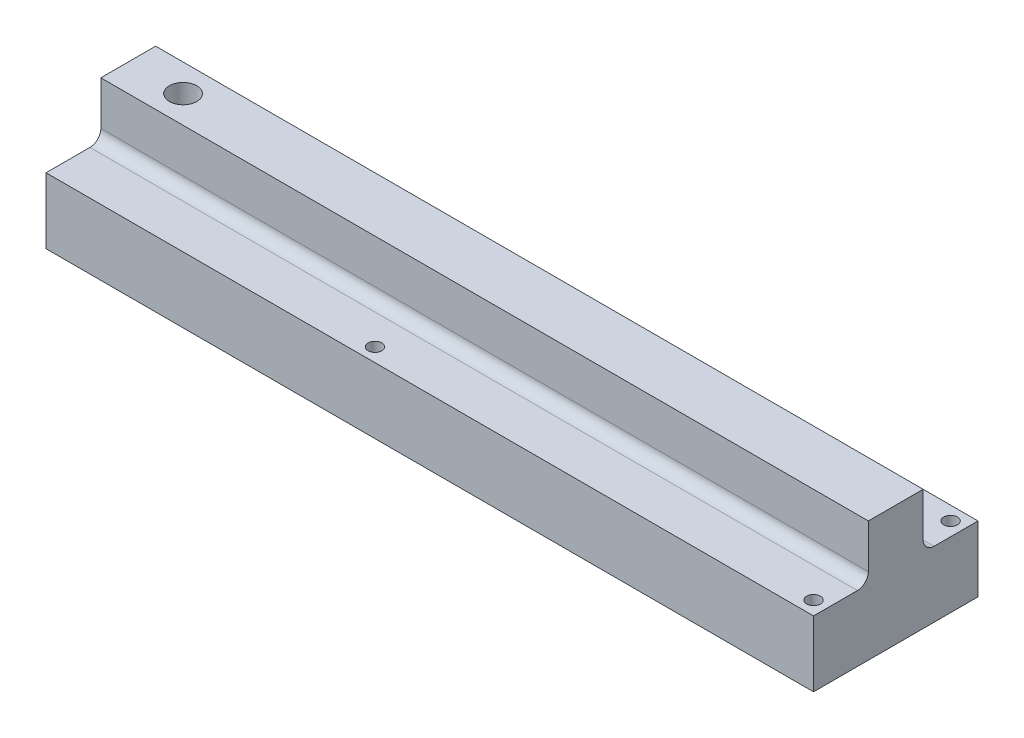
ISO-10303-21;
HEADER;
FILE_DESCRIPTION(('STEP AP214'),'2;1');
FILE_NAME('part.step','',(''),(''),'','','');
FILE_SCHEMA(('AUTOMOTIVE_DESIGN { 1 0 10303 214 1 1 1 1 }'));
ENDSEC;
DATA;
#1=APPLICATION_CONTEXT('core data for automotive mechanical design processes');
#2=APPLICATION_PROTOCOL_DEFINITION('international standard','automotive_design',2000,#1);
#3=PRODUCT_CONTEXT('',#1,'mechanical');
#4=PRODUCT('Part','Part','',(#3));
#5=PRODUCT_RELATED_PRODUCT_CATEGORY('part','',(#4));
#6=PRODUCT_DEFINITION_FORMATION('','',#4);
#7=PRODUCT_DEFINITION_CONTEXT('part definition',#1,'design');
#8=PRODUCT_DEFINITION('design','',#6,#7);
#9=PRODUCT_DEFINITION_SHAPE('','',#8);
#10=(LENGTH_UNIT() NAMED_UNIT(*) SI_UNIT(.MILLI.,.METRE.));
#11=(NAMED_UNIT(*) PLANE_ANGLE_UNIT() SI_UNIT($,.RADIAN.));
#12=(NAMED_UNIT(*) SI_UNIT($,.STERADIAN.) SOLID_ANGLE_UNIT());
#13=UNCERTAINTY_MEASURE_WITH_UNIT(LENGTH_MEASURE(1.E-05),#10,'distance_accuracy_value','');
#14=(GEOMETRIC_REPRESENTATION_CONTEXT(3) GLOBAL_UNCERTAINTY_ASSIGNED_CONTEXT((#13)) GLOBAL_UNIT_ASSIGNED_CONTEXT((#10,
#11,#12)) REPRESENTATION_CONTEXT('',''));
#15=CARTESIAN_POINT('',(0.,0.,0.));
#16=DIRECTION('',(0.,0.,1.));
#17=DIRECTION('',(1.,0.,0.));
#18=AXIS2_PLACEMENT_3D('',#15,#16,#17);
#19=CARTESIAN_POINT('',(280.,24.,0.));
#20=DIRECTION('',(0.,0.,1.));
#21=DIRECTION('',(1.,0.,0.));
#22=AXIS2_PLACEMENT_3D('',#19,#20,#21);
#23=PLANE('',#22);
#24=DIRECTION('',(0.,1.,0.));
#25=VECTOR('',#24,1.);
#26=CARTESIAN_POINT('',(0.,24.,0.));
#27=LINE('',#26,#25);
#28=CARTESIAN_POINT('',(0.,0.,0.));
#29=VERTEX_POINT('',#28);
#30=CARTESIAN_POINT('',(0.,24.,0.));
#31=VERTEX_POINT('',#30);
#32=EDGE_CURVE('E140',#29,#31,#27,.T.);
#33=ORIENTED_EDGE('',*,*,#32,.T.);
#34=DIRECTION('',(-1.,0.,0.));
#35=VECTOR('',#34,1.);
#36=CARTESIAN_POINT('',(280.,24.,0.));
#37=LINE('',#36,#35);
#38=CARTESIAN_POINT('',(280.,24.,0.));
#39=VERTEX_POINT('',#38);
#40=EDGE_CURVE('E121',#39,#31,#37,.T.);
#41=ORIENTED_EDGE('',*,*,#40,.F.);
#42=DIRECTION('',(0.,1.,0.));
#43=VECTOR('',#42,1.);
#44=CARTESIAN_POINT('',(280.,24.,0.));
#45=LINE('',#44,#43);
#46=CARTESIAN_POINT('',(280.,0.,0.));
#47=VERTEX_POINT('',#46);
#48=EDGE_CURVE('E128',#47,#39,#45,.T.);
#49=ORIENTED_EDGE('',*,*,#48,.F.);
#50=DIRECTION('',(-1.,0.,0.));
#51=VECTOR('',#50,1.);
#52=CARTESIAN_POINT('',(280.,0.,0.));
#53=LINE('',#52,#51);
#54=EDGE_CURVE('E189',#47,#29,#53,.T.);
#55=ORIENTED_EDGE('',*,*,#54,.T.);
#56=EDGE_LOOP('',(#33,#41,#49,#55));
#57=FACE_BOUND('',#56,.T.);
#58=ADVANCED_FACE('F39',(#57),#23,.F.);
#59=CARTESIAN_POINT('',(280.,24.,20.));
#60=DIRECTION('',(0.,-1.,0.));
#61=DIRECTION('',(0.,0.,-1.));
#62=AXIS2_PLACEMENT_3D('',#59,#60,#61);
#63=PLANE('',#62);
#64=CARTESIAN_POINT('',(115.,24.,5.));
#65=DIRECTION('',(0.,1.,0.));
#66=DIRECTION('',(0.,0.,-1.));
#67=AXIS2_PLACEMENT_3D('',#64,#65,#66);
#68=CIRCLE('',#67,2.50000000000001);
#69=CARTESIAN_POINT('',(115.,24.,2.49999999999999));
#70=VERTEX_POINT('',#69);
#71=EDGE_CURVE('E301',#70,#70,#68,.T.);
#72=ORIENTED_EDGE('',*,*,#71,.F.);
#73=EDGE_LOOP('',(#72));
#74=FACE_BOUND('',#73,.T.);
#75=CARTESIAN_POINT('',(275.,24.,5.));
#76=DIRECTION('',(0.,1.,0.));
#77=DIRECTION('',(0.,0.,-1.));
#78=AXIS2_PLACEMENT_3D('',#75,#76,#77);
#79=CIRCLE('',#78,2.50000000000002);
#80=CARTESIAN_POINT('',(275.,24.,2.49999999999997));
#81=VERTEX_POINT('',#80);
#82=EDGE_CURVE('E313',#81,#81,#79,.T.);
#83=ORIENTED_EDGE('',*,*,#82,.F.);
#84=EDGE_LOOP('',(#83));
#85=FACE_BOUND('',#84,.T.);
#86=DIRECTION('',(0.,0.,1.));
#87=VECTOR('',#86,1.);
#88=CARTESIAN_POINT('',(0.,24.,20.));
#89=LINE('',#88,#87);
#90=CARTESIAN_POINT('',(0.,24.,16.));
#91=VERTEX_POINT('',#90);
#92=EDGE_CURVE('E171',#31,#91,#89,.T.);
#93=ORIENTED_EDGE('',*,*,#92,.T.);
#94=DIRECTION('',(-1.,0.,0.));
#95=VECTOR('',#94,1.);
#96=CARTESIAN_POINT('',(280.,24.,16.));
#97=LINE('',#96,#95);
#98=CARTESIAN_POINT('',(280.,24.,16.));
#99=VERTEX_POINT('',#98);
#100=EDGE_CURVE('E124',#91,#99,#97,.F.);
#101=ORIENTED_EDGE('',*,*,#100,.T.);
#102=DIRECTION('',(0.,0.,1.));
#103=VECTOR('',#102,1.);
#104=CARTESIAN_POINT('',(280.,24.,20.));
#105=LINE('',#104,#103);
#106=EDGE_CURVE('E116',#39,#99,#105,.T.);
#107=ORIENTED_EDGE('',*,*,#106,.F.);
#108=ORIENTED_EDGE('',*,*,#40,.T.);
#109=EDGE_LOOP('',(#93,#101,#107,#108));
#110=FACE_BOUND('',#109,.T.);
#111=ADVANCED_FACE('F119',(#74,#85,#110),#63,.F.);
#112=CARTESIAN_POINT('',(280.,44.,20.));
#113=DIRECTION('',(0.,0.,1.));
#114=DIRECTION('',(0.,-1.,0.));
#115=AXIS2_PLACEMENT_3D('',#112,#113,#114);
#116=PLANE('',#115);
#117=DIRECTION('',(0.,1.,0.));
#118=VECTOR('',#117,1.);
#119=CARTESIAN_POINT('',(280.,44.,20.));
#120=LINE('',#119,#118);
#121=CARTESIAN_POINT('',(280.,28.,20.));
#122=VERTEX_POINT('',#121);
#123=CARTESIAN_POINT('',(280.,44.,20.));
#124=VERTEX_POINT('',#123);
#125=EDGE_CURVE('E127',#122,#124,#120,.T.);
#126=ORIENTED_EDGE('',*,*,#125,.F.);
#127=DIRECTION('',(-1.,0.,0.));
#128=VECTOR('',#127,1.);
#129=CARTESIAN_POINT('',(0.,28.,20.));
#130=LINE('',#129,#128);
#131=CARTESIAN_POINT('',(0.,28.,20.));
#132=VERTEX_POINT('',#131);
#133=EDGE_CURVE('E141',#122,#132,#130,.T.);
#134=ORIENTED_EDGE('',*,*,#133,.T.);
#135=DIRECTION('',(0.,1.,0.));
#136=VECTOR('',#135,1.);
#137=CARTESIAN_POINT('',(0.,44.,20.));
#138=LINE('',#137,#136);
#139=CARTESIAN_POINT('',(0.,44.,20.));
#140=VERTEX_POINT('',#139);
#141=EDGE_CURVE('E173',#132,#140,#138,.T.);
#142=ORIENTED_EDGE('',*,*,#141,.T.);
#143=DIRECTION('',(-1.,0.,0.));
#144=VECTOR('',#143,1.);
#145=CARTESIAN_POINT('',(280.,44.,20.));
#146=LINE('',#145,#144);
#147=EDGE_CURVE('E142',#124,#140,#146,.T.);
#148=ORIENTED_EDGE('',*,*,#147,.F.);
#149=EDGE_LOOP('',(#126,#134,#142,#148));
#150=FACE_BOUND('',#149,.T.);
#151=ADVANCED_FACE('F164',(#150),#116,.F.);
#152=CARTESIAN_POINT('',(280.,44.,40.));
#153=DIRECTION('',(0.,-1.,0.));
#154=DIRECTION('',(0.,0.,-1.));
#155=AXIS2_PLACEMENT_3D('',#152,#153,#154);
#156=PLANE('',#155);
#157=CARTESIAN_POINT('',(20.,44.,30.));
#158=DIRECTION('',(0.,1.,0.));
#159=DIRECTION('',(0.,0.,1.));
#160=AXIS2_PLACEMENT_3D('',#157,#158,#159);
#161=CIRCLE('',#160,5.);
#162=CARTESIAN_POINT('',(20.,44.,35.));
#163=VERTEX_POINT('',#162);
#164=EDGE_CURVE('E298',#163,#163,#161,.T.);
#165=ORIENTED_EDGE('',*,*,#164,.F.);
#166=EDGE_LOOP('',(#165));
#167=FACE_BOUND('',#166,.T.);
#168=DIRECTION('',(0.,0.,1.));
#169=VECTOR('',#168,1.);
#170=CARTESIAN_POINT('',(0.,44.,40.));
#171=LINE('',#170,#169);
#172=CARTESIAN_POINT('',(0.,44.,40.));
#173=VERTEX_POINT('',#172);
#174=EDGE_CURVE('E175',#140,#173,#171,.T.);
#175=ORIENTED_EDGE('',*,*,#174,.T.);
#176=DIRECTION('',(-1.,0.,0.));
#177=VECTOR('',#176,1.);
#178=CARTESIAN_POINT('',(280.,44.,40.));
#179=LINE('',#178,#177);
#180=CARTESIAN_POINT('',(280.,44.,40.));
#181=VERTEX_POINT('',#180);
#182=EDGE_CURVE('E147',#181,#173,#179,.T.);
#183=ORIENTED_EDGE('',*,*,#182,.F.);
#184=DIRECTION('',(0.,0.,1.));
#185=VECTOR('',#184,1.);
#186=CARTESIAN_POINT('',(280.,44.,40.));
#187=LINE('',#186,#185);
#188=EDGE_CURVE('E167',#124,#181,#187,.T.);
#189=ORIENTED_EDGE('',*,*,#188,.F.);
#190=ORIENTED_EDGE('',*,*,#147,.T.);
#191=EDGE_LOOP('',(#175,#183,#189,#190));
#192=FACE_BOUND('',#191,.T.);
#193=ADVANCED_FACE('F201',(#167,#192),#156,.F.);
#194=CARTESIAN_POINT('',(280.,24.,40.));
#195=DIRECTION('',(0.,0.,-1.));
#196=DIRECTION('',(-1.,0.,0.));
#197=AXIS2_PLACEMENT_3D('',#194,#195,#196);
#198=PLANE('',#197);
#199=DIRECTION('',(0.,-1.,0.));
#200=VECTOR('',#199,1.);
#201=CARTESIAN_POINT('',(0.,24.,40.));
#202=LINE('',#201,#200);
#203=CARTESIAN_POINT('',(0.,28.,40.));
#204=VERTEX_POINT('',#203);
#205=EDGE_CURVE('E182',#173,#204,#202,.T.);
#206=ORIENTED_EDGE('',*,*,#205,.T.);
#207=DIRECTION('',(-1.,0.,0.));
#208=VECTOR('',#207,1.);
#209=CARTESIAN_POINT('',(280.,28.,40.));
#210=LINE('',#209,#208);
#211=CARTESIAN_POINT('',(280.,28.,40.));
#212=VERTEX_POINT('',#211);
#213=EDGE_CURVE('E54',#204,#212,#210,.F.);
#214=ORIENTED_EDGE('',*,*,#213,.T.);
#215=DIRECTION('',(0.,-1.,0.));
#216=VECTOR('',#215,1.);
#217=CARTESIAN_POINT('',(280.,24.,40.));
#218=LINE('',#217,#216);
#219=EDGE_CURVE('E199',#181,#212,#218,.T.);
#220=ORIENTED_EDGE('',*,*,#219,.F.);
#221=ORIENTED_EDGE('',*,*,#182,.T.);
#222=EDGE_LOOP('',(#206,#214,#220,#221));
#223=FACE_BOUND('',#222,.T.);
#224=ADVANCED_FACE('F198',(#223),#198,.F.);
#225=CARTESIAN_POINT('',(280.,24.,60.));
#226=DIRECTION('',(0.,-1.,0.));
#227=DIRECTION('',(0.,0.,-1.));
#228=AXIS2_PLACEMENT_3D('',#225,#226,#227);
#229=PLANE('',#228);
#230=CARTESIAN_POINT('',(275.,24.,55.));
#231=DIRECTION('',(0.,1.,0.));
#232=DIRECTION('',(0.,0.,1.));
#233=AXIS2_PLACEMENT_3D('',#230,#231,#232);
#234=CIRCLE('',#233,2.50000000000002);
#235=CARTESIAN_POINT('',(275.,24.,57.5));
#236=VERTEX_POINT('',#235);
#237=EDGE_CURVE('E306',#236,#236,#234,.T.);
#238=ORIENTED_EDGE('',*,*,#237,.F.);
#239=EDGE_LOOP('',(#238));
#240=FACE_BOUND('',#239,.T.);
#241=CARTESIAN_POINT('',(115.,24.,55.));
#242=DIRECTION('',(0.,1.,0.));
#243=DIRECTION('',(0.,0.,1.));
#244=AXIS2_PLACEMENT_3D('',#241,#242,#243);
#245=CIRCLE('',#244,2.50000000000001);
#246=CARTESIAN_POINT('',(115.,24.,57.5));
#247=VERTEX_POINT('',#246);
#248=EDGE_CURVE('E309',#247,#247,#245,.T.);
#249=ORIENTED_EDGE('',*,*,#248,.F.);
#250=EDGE_LOOP('',(#249));
#251=FACE_BOUND('',#250,.T.);
#252=DIRECTION('',(0.,0.,1.));
#253=VECTOR('',#252,1.);
#254=CARTESIAN_POINT('',(280.,24.,60.));
#255=LINE('',#254,#253);
#256=CARTESIAN_POINT('',(280.,24.,44.));
#257=VERTEX_POINT('',#256);
#258=CARTESIAN_POINT('',(280.,24.,60.));
#259=VERTEX_POINT('',#258);
#260=EDGE_CURVE('E203',#257,#259,#255,.T.);
#261=ORIENTED_EDGE('',*,*,#260,.F.);
#262=DIRECTION('',(-1.,0.,0.));
#263=VECTOR('',#262,1.);
#264=CARTESIAN_POINT('',(0.,24.,44.));
#265=LINE('',#264,#263);
#266=CARTESIAN_POINT('',(0.,24.,44.));
#267=VERTEX_POINT('',#266);
#268=EDGE_CURVE('E152',#257,#267,#265,.T.);
#269=ORIENTED_EDGE('',*,*,#268,.T.);
#270=DIRECTION('',(0.,0.,1.));
#271=VECTOR('',#270,1.);
#272=CARTESIAN_POINT('',(0.,24.,60.));
#273=LINE('',#272,#271);
#274=CARTESIAN_POINT('',(0.,24.,60.));
#275=VERTEX_POINT('',#274);
#276=EDGE_CURVE('E184',#267,#275,#273,.T.);
#277=ORIENTED_EDGE('',*,*,#276,.T.);
#278=DIRECTION('',(-1.,0.,0.));
#279=VECTOR('',#278,1.);
#280=CARTESIAN_POINT('',(280.,24.,60.));
#281=LINE('',#280,#279);
#282=EDGE_CURVE('E194',#259,#275,#281,.T.);
#283=ORIENTED_EDGE('',*,*,#282,.F.);
#284=EDGE_LOOP('',(#261,#269,#277,#283));
#285=FACE_BOUND('',#284,.T.);
#286=ADVANCED_FACE('F219',(#240,#251,#285),#229,.F.);
#287=CARTESIAN_POINT('',(280.,0.,60.));
#288=DIRECTION('',(0.,0.,-1.));
#289=DIRECTION('',(-1.,0.,0.));
#290=AXIS2_PLACEMENT_3D('',#287,#288,#289);
#291=PLANE('',#290);
#292=DIRECTION('',(0.,-1.,0.));
#293=VECTOR('',#292,1.);
#294=CARTESIAN_POINT('',(0.,0.,60.));
#295=LINE('',#294,#293);
#296=CARTESIAN_POINT('',(0.,0.,60.));
#297=VERTEX_POINT('',#296);
#298=EDGE_CURVE('E186',#275,#297,#295,.T.);
#299=ORIENTED_EDGE('',*,*,#298,.T.);
#300=DIRECTION('',(-1.,0.,0.));
#301=VECTOR('',#300,1.);
#302=CARTESIAN_POINT('',(280.,0.,60.));
#303=LINE('',#302,#301);
#304=CARTESIAN_POINT('',(280.,0.,60.));
#305=VERTEX_POINT('',#304);
#306=EDGE_CURVE('E191',#305,#297,#303,.T.);
#307=ORIENTED_EDGE('',*,*,#306,.F.);
#308=DIRECTION('',(0.,-1.,0.));
#309=VECTOR('',#308,1.);
#310=CARTESIAN_POINT('',(280.,0.,60.));
#311=LINE('',#310,#309);
#312=EDGE_CURVE('E207',#259,#305,#311,.T.);
#313=ORIENTED_EDGE('',*,*,#312,.F.);
#314=ORIENTED_EDGE('',*,*,#282,.T.);
#315=EDGE_LOOP('',(#299,#307,#313,#314));
#316=FACE_BOUND('',#315,.T.);
#317=ADVANCED_FACE('F213',(#316),#291,.F.);
#318=CARTESIAN_POINT('',(280.,0.,0.));
#319=DIRECTION('',(0.,1.,0.));
#320=DIRECTION('',(0.,0.,1.));
#321=AXIS2_PLACEMENT_3D('',#318,#319,#320);
#322=PLANE('',#321);
#323=DIRECTION('',(0.,0.,-1.));
#324=VECTOR('',#323,1.);
#325=CARTESIAN_POINT('',(0.,0.,0.));
#326=LINE('',#325,#324);
#327=EDGE_CURVE('E137',#297,#29,#326,.T.);
#328=ORIENTED_EDGE('',*,*,#327,.T.);
#329=ORIENTED_EDGE('',*,*,#54,.F.);
#330=DIRECTION('',(0.,0.,-1.));
#331=VECTOR('',#330,1.);
#332=CARTESIAN_POINT('',(280.,0.,0.));
#333=LINE('',#332,#331);
#334=EDGE_CURVE('E133',#305,#47,#333,.T.);
#335=ORIENTED_EDGE('',*,*,#334,.F.);
#336=ORIENTED_EDGE('',*,*,#306,.T.);
#337=EDGE_LOOP('',(#328,#329,#335,#336));
#338=FACE_BOUND('',#337,.T.);
#339=ADVANCED_FACE('F217',(#338),#322,.F.);
#340=CARTESIAN_POINT('',(280.,0.,0.));
#341=DIRECTION('',(-1.,0.,0.));
#342=DIRECTION('',(0.,0.,1.));
#343=AXIS2_PLACEMENT_3D('',#340,#341,#342);
#344=PLANE('',#343);
#345=ORIENTED_EDGE('',*,*,#48,.T.);
#346=ORIENTED_EDGE('',*,*,#106,.T.);
#347=CARTESIAN_POINT('',(280.,28.,16.));
#348=DIRECTION('',(-1.,0.,0.));
#349=DIRECTION('',(0.,0.,1.));
#350=AXIS2_PLACEMENT_3D('',#347,#348,#349);
#351=CIRCLE('',#350,4.);
#352=EDGE_CURVE('E158',#99,#122,#351,.T.);
#353=ORIENTED_EDGE('',*,*,#352,.T.);
#354=ORIENTED_EDGE('',*,*,#125,.T.);
#355=ORIENTED_EDGE('',*,*,#188,.T.);
#356=ORIENTED_EDGE('',*,*,#219,.T.);
#357=CARTESIAN_POINT('',(280.,28.,44.));
#358=DIRECTION('',(-1.,0.,0.));
#359=DIRECTION('',(0.,0.,1.));
#360=AXIS2_PLACEMENT_3D('',#357,#358,#359);
#361=CIRCLE('',#360,4.);
#362=EDGE_CURVE('E11',#212,#257,#361,.T.);
#363=ORIENTED_EDGE('',*,*,#362,.T.);
#364=ORIENTED_EDGE('',*,*,#260,.T.);
#365=ORIENTED_EDGE('',*,*,#312,.T.);
#366=ORIENTED_EDGE('',*,*,#334,.T.);
#367=EDGE_LOOP('',(#345,#346,#353,#354,#355,#356,#363,#364,#365,#366));
#368=FACE_BOUND('',#367,.T.);
#369=ADVANCED_FACE('F131',(#368),#344,.F.);
#370=CARTESIAN_POINT('',(0.,0.,0.));
#371=DIRECTION('',(-1.,0.,0.));
#372=DIRECTION('',(0.,0.,1.));
#373=AXIS2_PLACEMENT_3D('',#370,#371,#372);
#374=PLANE('',#373);
#375=ORIENTED_EDGE('',*,*,#32,.F.);
#376=ORIENTED_EDGE('',*,*,#327,.F.);
#377=ORIENTED_EDGE('',*,*,#298,.F.);
#378=ORIENTED_EDGE('',*,*,#276,.F.);
#379=CARTESIAN_POINT('',(0.,28.,44.));
#380=DIRECTION('',(-1.,0.,0.));
#381=DIRECTION('',(0.,0.,1.));
#382=AXIS2_PLACEMENT_3D('',#379,#380,#381);
#383=CIRCLE('',#382,4.);
#384=EDGE_CURVE('E47',#267,#204,#383,.F.);
#385=ORIENTED_EDGE('',*,*,#384,.T.);
#386=ORIENTED_EDGE('',*,*,#205,.F.);
#387=ORIENTED_EDGE('',*,*,#174,.F.);
#388=ORIENTED_EDGE('',*,*,#141,.F.);
#389=CARTESIAN_POINT('',(0.,28.,16.));
#390=DIRECTION('',(-1.,0.,0.));
#391=DIRECTION('',(0.,0.,1.));
#392=AXIS2_PLACEMENT_3D('',#389,#390,#391);
#393=CIRCLE('',#392,4.);
#394=EDGE_CURVE('E156',#132,#91,#393,.F.);
#395=ORIENTED_EDGE('',*,*,#394,.T.);
#396=ORIENTED_EDGE('',*,*,#92,.F.);
#397=EDGE_LOOP('',(#375,#376,#377,#378,#385,#386,#387,#388,#395,#396));
#398=FACE_BOUND('',#397,.T.);
#399=ADVANCED_FACE('F170',(#398),#374,.T.);
#400=CARTESIAN_POINT('',(115.,16.,55.));
#401=DIRECTION('',(0.,1.,0.));
#402=DIRECTION('',(0.,0.,1.));
#403=AXIS2_PLACEMENT_3D('',#400,#401,#402);
#404=CYLINDRICAL_SURFACE('',#403,2.50000000000001);
#405=CARTESIAN_POINT('',(115.,16.,55.));
#406=DIRECTION('',(0.,1.,0.));
#407=DIRECTION('',(0.,0.,1.));
#408=AXIS2_PLACEMENT_3D('',#405,#406,#407);
#409=CIRCLE('',#408,2.50000000000001);
#410=CARTESIAN_POINT('',(115.,16.,57.5));
#411=VERTEX_POINT('',#410);
#412=EDGE_CURVE('E177',#411,#411,#409,.T.);
#413=ORIENTED_EDGE('',*,*,#412,.F.);
#414=EDGE_LOOP('',(#413));
#415=FACE_BOUND('',#414,.T.);
#416=ORIENTED_EDGE('',*,*,#248,.T.);
#417=EDGE_LOOP('',(#416));
#418=FACE_BOUND('',#417,.T.);
#419=ADVANCED_FACE('F257',(#415,#418),#404,.F.);
#420=CARTESIAN_POINT('',(115.,16.,55.));
#421=DIRECTION('',(0.,1.,0.));
#422=DIRECTION('',(0.,0.,1.));
#423=AXIS2_PLACEMENT_3D('',#420,#421,#422);
#424=PLANE('',#423);
#425=ORIENTED_EDGE('',*,*,#412,.T.);
#426=EDGE_LOOP('',(#425));
#427=FACE_BOUND('',#426,.T.);
#428=ADVANCED_FACE('F262',(#427),#424,.T.);
#429=CARTESIAN_POINT('',(275.,16.,55.));
#430=DIRECTION('',(0.,1.,0.));
#431=DIRECTION('',(0.,0.,1.));
#432=AXIS2_PLACEMENT_3D('',#429,#430,#431);
#433=CYLINDRICAL_SURFACE('',#432,2.50000000000002);
#434=CARTESIAN_POINT('',(275.,16.,55.));
#435=DIRECTION('',(0.,1.,0.));
#436=DIRECTION('',(0.,0.,1.));
#437=AXIS2_PLACEMENT_3D('',#434,#435,#436);
#438=CIRCLE('',#437,2.50000000000002);
#439=CARTESIAN_POINT('',(275.,16.,57.5));
#440=VERTEX_POINT('',#439);
#441=EDGE_CURVE('E310',#440,#440,#438,.T.);
#442=ORIENTED_EDGE('',*,*,#441,.F.);
#443=EDGE_LOOP('',(#442));
#444=FACE_BOUND('',#443,.T.);
#445=ORIENTED_EDGE('',*,*,#237,.T.);
#446=EDGE_LOOP('',(#445));
#447=FACE_BOUND('',#446,.T.);
#448=ADVANCED_FACE('F266',(#444,#447),#433,.F.);
#449=CARTESIAN_POINT('',(275.,16.,55.));
#450=DIRECTION('',(0.,1.,0.));
#451=DIRECTION('',(0.,0.,1.));
#452=AXIS2_PLACEMENT_3D('',#449,#450,#451);
#453=PLANE('',#452);
#454=ORIENTED_EDGE('',*,*,#441,.T.);
#455=EDGE_LOOP('',(#454));
#456=FACE_BOUND('',#455,.T.);
#457=ADVANCED_FACE('F282',(#456),#453,.T.);
#458=CARTESIAN_POINT('',(275.,16.,5.));
#459=DIRECTION('',(0.,1.,0.));
#460=DIRECTION('',(0.,0.,1.));
#461=AXIS2_PLACEMENT_3D('',#458,#459,#460);
#462=CYLINDRICAL_SURFACE('',#461,2.50000000000002);
#463=CARTESIAN_POINT('',(275.,16.,5.));
#464=DIRECTION('',(0.,1.,0.));
#465=DIRECTION('',(0.,0.,-1.));
#466=AXIS2_PLACEMENT_3D('',#463,#464,#465);
#467=CIRCLE('',#466,2.50000000000002);
#468=CARTESIAN_POINT('',(275.,16.,2.49999999999997));
#469=VERTEX_POINT('',#468);
#470=EDGE_CURVE('E316',#469,#469,#467,.T.);
#471=ORIENTED_EDGE('',*,*,#470,.F.);
#472=EDGE_LOOP('',(#471));
#473=FACE_BOUND('',#472,.T.);
#474=ORIENTED_EDGE('',*,*,#82,.T.);
#475=EDGE_LOOP('',(#474));
#476=FACE_BOUND('',#475,.T.);
#477=ADVANCED_FACE('F278',(#473,#476),#462,.F.);
#478=CARTESIAN_POINT('',(275.,16.,5.));
#479=DIRECTION('',(0.,-1.,0.));
#480=DIRECTION('',(0.,0.,-1.));
#481=AXIS2_PLACEMENT_3D('',#478,#479,#480);
#482=PLANE('',#481);
#483=ORIENTED_EDGE('',*,*,#470,.T.);
#484=EDGE_LOOP('',(#483));
#485=FACE_BOUND('',#484,.T.);
#486=ADVANCED_FACE('F274',(#485),#482,.F.);
#487=CARTESIAN_POINT('',(115.,16.,5.));
#488=DIRECTION('',(0.,1.,0.));
#489=DIRECTION('',(0.,0.,1.));
#490=AXIS2_PLACEMENT_3D('',#487,#488,#489);
#491=CYLINDRICAL_SURFACE('',#490,2.50000000000001);
#492=CARTESIAN_POINT('',(115.,16.,5.));
#493=DIRECTION('',(0.,1.,0.));
#494=DIRECTION('',(0.,0.,-1.));
#495=AXIS2_PLACEMENT_3D('',#492,#493,#494);
#496=CIRCLE('',#495,2.50000000000001);
#497=CARTESIAN_POINT('',(115.,16.,2.49999999999999));
#498=VERTEX_POINT('',#497);
#499=EDGE_CURVE('E297',#498,#498,#496,.T.);
#500=ORIENTED_EDGE('',*,*,#499,.F.);
#501=EDGE_LOOP('',(#500));
#502=FACE_BOUND('',#501,.T.);
#503=ORIENTED_EDGE('',*,*,#71,.T.);
#504=EDGE_LOOP('',(#503));
#505=FACE_BOUND('',#504,.T.);
#506=ADVANCED_FACE('F270',(#502,#505),#491,.F.);
#507=CARTESIAN_POINT('',(115.,16.,5.));
#508=DIRECTION('',(0.,-1.,0.));
#509=DIRECTION('',(0.,0.,-1.));
#510=AXIS2_PLACEMENT_3D('',#507,#508,#509);
#511=PLANE('',#510);
#512=ORIENTED_EDGE('',*,*,#499,.T.);
#513=EDGE_LOOP('',(#512));
#514=FACE_BOUND('',#513,.T.);
#515=ADVANCED_FACE('F233',(#514),#511,.F.);
#516=CARTESIAN_POINT('',(280.,28.,16.));
#517=DIRECTION('',(1.,0.,0.));
#518=DIRECTION('',(0.,0.,-1.));
#519=AXIS2_PLACEMENT_3D('',#516,#517,#518);
#520=CYLINDRICAL_SURFACE('',#519,4.);
#521=ORIENTED_EDGE('',*,*,#352,.F.);
#522=ORIENTED_EDGE('',*,*,#100,.F.);
#523=ORIENTED_EDGE('',*,*,#394,.F.);
#524=ORIENTED_EDGE('',*,*,#133,.F.);
#525=EDGE_LOOP('',(#521,#522,#523,#524));
#526=FACE_BOUND('',#525,.T.);
#527=ADVANCED_FACE('F169',(#526),#520,.F.);
#528=CARTESIAN_POINT('',(280.,28.,44.));
#529=DIRECTION('',(1.,0.,0.));
#530=DIRECTION('',(0.,0.,-1.));
#531=AXIS2_PLACEMENT_3D('',#528,#529,#530);
#532=CYLINDRICAL_SURFACE('',#531,4.);
#533=ORIENTED_EDGE('',*,*,#362,.F.);
#534=ORIENTED_EDGE('',*,*,#213,.F.);
#535=ORIENTED_EDGE('',*,*,#384,.F.);
#536=ORIENTED_EDGE('',*,*,#268,.F.);
#537=EDGE_LOOP('',(#533,#534,#535,#536));
#538=FACE_BOUND('',#537,.T.);
#539=ADVANCED_FACE('F41',(#538),#532,.F.);
#540=CARTESIAN_POINT('',(20.,34.,30.));
#541=DIRECTION('',(0.,1.,0.));
#542=DIRECTION('',(0.,0.,1.));
#543=AXIS2_PLACEMENT_3D('',#540,#541,#542);
#544=CYLINDRICAL_SURFACE('',#543,5.);
#545=CARTESIAN_POINT('',(20.,34.,30.));
#546=DIRECTION('',(0.,1.,0.));
#547=DIRECTION('',(0.,0.,1.));
#548=AXIS2_PLACEMENT_3D('',#545,#546,#547);
#549=CIRCLE('',#548,5.);
#550=CARTESIAN_POINT('',(20.,34.,35.));
#551=VERTEX_POINT('',#550);
#552=EDGE_CURVE('E296',#551,#551,#549,.T.);
#553=ORIENTED_EDGE('',*,*,#552,.F.);
#554=EDGE_LOOP('',(#553));
#555=FACE_BOUND('',#554,.T.);
#556=ORIENTED_EDGE('',*,*,#164,.T.);
#557=EDGE_LOOP('',(#556));
#558=FACE_BOUND('',#557,.T.);
#559=ADVANCED_FACE('F224',(#555,#558),#544,.F.);
#560=CARTESIAN_POINT('',(20.,34.,30.));
#561=DIRECTION('',(0.,1.,0.));
#562=DIRECTION('',(0.,0.,1.));
#563=AXIS2_PLACEMENT_3D('',#560,#561,#562);
#564=PLANE('',#563);
#565=ORIENTED_EDGE('',*,*,#552,.T.);
#566=EDGE_LOOP('',(#565));
#567=FACE_BOUND('',#566,.T.);
#568=ADVANCED_FACE('F230',(#567),#564,.T.);
#569=CLOSED_SHELL('',(#58,#111,#151,#193,#224,#286,#317,#339,#369,#399,#419,#428,#448,#457,#477,
#486,#506,#515,#527,#539,#559,#568));
#570=MANIFOLD_SOLID_BREP('B2',#569);
#571=ADVANCED_BREP_SHAPE_REPRESENTATION('',(#18,#570),#14);
#572=SHAPE_DEFINITION_REPRESENTATION(#9,#571);
ENDSEC;
END-ISO-10303-21;
